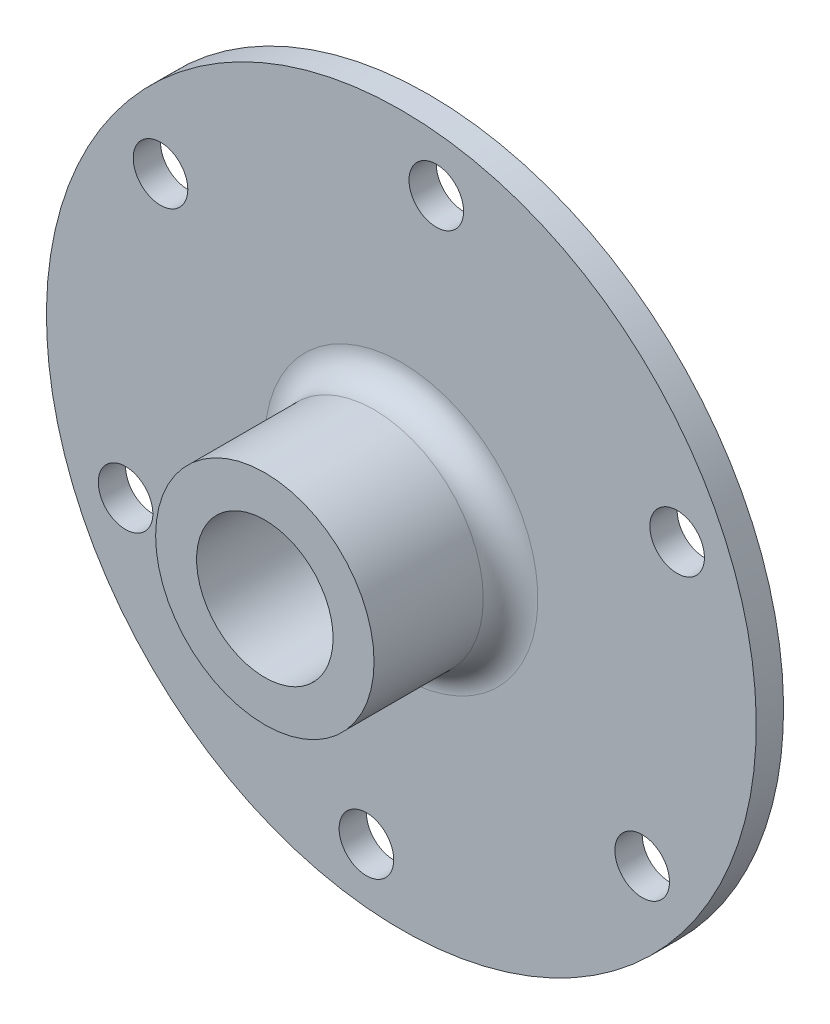
ISO-10303-21;
HEADER;
FILE_DESCRIPTION(('STEP AP214'),'2;1');
FILE_NAME('part.step','',(''),(''),'','','');
FILE_SCHEMA(('AUTOMOTIVE_DESIGN { 1 0 10303 214 1 1 1 1 }'));
ENDSEC;
DATA;
#1=APPLICATION_CONTEXT('core data for automotive mechanical design processes');
#2=APPLICATION_PROTOCOL_DEFINITION('international standard','automotive_design',2000,#1);
#3=PRODUCT_CONTEXT('',#1,'mechanical');
#4=PRODUCT('Part','Part','',(#3));
#5=PRODUCT_RELATED_PRODUCT_CATEGORY('part','',(#4));
#6=PRODUCT_DEFINITION_FORMATION('','',#4);
#7=PRODUCT_DEFINITION_CONTEXT('part definition',#1,'design');
#8=PRODUCT_DEFINITION('design','',#6,#7);
#9=PRODUCT_DEFINITION_SHAPE('','',#8);
#10=(LENGTH_UNIT() NAMED_UNIT(*) SI_UNIT(.MILLI.,.METRE.));
#11=(NAMED_UNIT(*) PLANE_ANGLE_UNIT() SI_UNIT($,.RADIAN.));
#12=(NAMED_UNIT(*) SI_UNIT($,.STERADIAN.) SOLID_ANGLE_UNIT());
#13=UNCERTAINTY_MEASURE_WITH_UNIT(LENGTH_MEASURE(1.E-05),#10,'distance_accuracy_value','');
#14=(GEOMETRIC_REPRESENTATION_CONTEXT(3) GLOBAL_UNCERTAINTY_ASSIGNED_CONTEXT((#13)) GLOBAL_UNIT_ASSIGNED_CONTEXT((#10,
#11,#12)) REPRESENTATION_CONTEXT('',''));
#15=CARTESIAN_POINT('',(0.,0.,0.));
#16=DIRECTION('',(0.,0.,1.));
#17=DIRECTION('',(1.,0.,0.));
#18=AXIS2_PLACEMENT_3D('',#15,#16,#17);
#19=CARTESIAN_POINT('',(0.,0.,19.05));
#20=DIRECTION('',(0.,0.,1.));
#21=DIRECTION('',(0.,-1.,0.));
#22=AXIS2_PLACEMENT_3D('',#19,#20,#21);
#23=PLANE('',#22);
#24=CARTESIAN_POINT('',(0.,0.,19.05));
#25=DIRECTION('',(0.,0.,1.));
#26=DIRECTION('',(1.,0.,0.));
#27=AXIS2_PLACEMENT_3D('',#24,#25,#26);
#28=CIRCLE('',#27,7.9375);
#29=CARTESIAN_POINT('',(7.9375,0.,19.05));
#30=VERTEX_POINT('',#29);
#31=EDGE_CURVE('E80',#30,#30,#28,.T.);
#32=ORIENTED_EDGE('',*,*,#31,.F.);
#33=EDGE_LOOP('',(#32));
#34=FACE_BOUND('',#33,.T.);
#35=CARTESIAN_POINT('',(0.,0.,19.05));
#36=DIRECTION('',(0.,0.,-1.));
#37=DIRECTION('',(0.,1.,0.));
#38=AXIS2_PLACEMENT_3D('',#35,#36,#37);
#39=CIRCLE('',#38,12.7);
#40=CARTESIAN_POINT('',(0.,12.7,19.05));
#41=VERTEX_POINT('',#40);
#42=EDGE_CURVE('E56',#41,#41,#39,.T.);
#43=ORIENTED_EDGE('',*,*,#42,.F.);
#44=EDGE_LOOP('',(#43));
#45=FACE_BOUND('',#44,.T.);
#46=ADVANCED_FACE('F43',(#34,#45),#23,.T.);
#47=CARTESIAN_POINT('',(0.,0.,0.));
#48=DIRECTION('',(0.,0.,-1.));
#49=DIRECTION('',(0.,1.,0.));
#50=AXIS2_PLACEMENT_3D('',#47,#48,#49);
#51=CYLINDRICAL_SURFACE('',#50,12.7);
#52=CARTESIAN_POINT('',(0.,0.,6.35));
#53=DIRECTION('',(0.,0.,1.));
#54=DIRECTION('',(0.,-1.,0.));
#55=AXIS2_PLACEMENT_3D('',#52,#53,#54);
#56=CIRCLE('',#55,12.7);
#57=CARTESIAN_POINT('',(0.,-12.7,6.34999999999999));
#58=VERTEX_POINT('',#57);
#59=EDGE_CURVE('E10',#58,#58,#56,.T.);
#60=ORIENTED_EDGE('',*,*,#59,.T.);
#61=EDGE_LOOP('',(#60));
#62=FACE_BOUND('',#61,.T.);
#63=ORIENTED_EDGE('',*,*,#42,.T.);
#64=EDGE_LOOP('',(#63));
#65=FACE_BOUND('',#64,.T.);
#66=ADVANCED_FACE('F148',(#62,#65),#51,.T.);
#67=CARTESIAN_POINT('',(0.,12.7,3.175));
#68=DIRECTION('',(0.,0.,1.));
#69=DIRECTION('',(0.,-1.,0.));
#70=AXIS2_PLACEMENT_3D('',#67,#68,#69);
#71=PLANE('',#70);
#72=CARTESIAN_POINT('',(0.,0.,3.175));
#73=DIRECTION('',(0.,0.,1.));
#74=DIRECTION('',(0.,-1.,0.));
#75=AXIS2_PLACEMENT_3D('',#72,#73,#74);
#76=CIRCLE('',#75,15.875);
#77=CARTESIAN_POINT('',(0.,-15.875,3.17499999999999));
#78=VERTEX_POINT('',#77);
#79=EDGE_CURVE('E51',#78,#78,#76,.F.);
#80=ORIENTED_EDGE('',*,*,#79,.T.);
#81=EDGE_LOOP('',(#80));
#82=FACE_BOUND('',#81,.T.);
#83=CARTESIAN_POINT('',(-32.0723720807494,-13.8245641563837,3.17499999999999));
#84=DIRECTION('',(0.,0.,1.));
#85=DIRECTION('',(0.,-1.,0.));
#86=AXIS2_PLACEMENT_3D('',#83,#84,#85);
#87=CIRCLE('',#86,3.175);
#88=CARTESIAN_POINT('',(-32.0723720807494,-16.9995641563837,3.17499999999999));
#89=VERTEX_POINT('',#88);
#90=EDGE_CURVE('E81',#89,#89,#87,.T.);
#91=ORIENTED_EDGE('',*,*,#90,.F.);
#92=EDGE_LOOP('',(#91));
#93=FACE_BOUND('',#92,.T.);
#94=CARTESIAN_POINT('',(32.0723720807493,13.8245641563839,3.175));
#95=DIRECTION('',(0.,0.,1.));
#96=DIRECTION('',(0.,-1.,0.));
#97=AXIS2_PLACEMENT_3D('',#94,#95,#96);
#98=CIRCLE('',#97,3.175);
#99=CARTESIAN_POINT('',(32.0723720807493,10.6495641563839,3.175));
#100=VERTEX_POINT('',#99);
#101=EDGE_CURVE('E91',#100,#100,#98,.T.);
#102=ORIENTED_EDGE('',*,*,#101,.F.);
#103=EDGE_LOOP('',(#102));
#104=FACE_BOUND('',#103,.T.);
#105=CARTESIAN_POINT('',(4.06376228469833,34.6877710597476,3.175));
#106=DIRECTION('',(0.,0.,1.));
#107=DIRECTION('',(0.,-1.,0.));
#108=AXIS2_PLACEMENT_3D('',#105,#106,#107);
#109=CIRCLE('',#108,3.175);
#110=CARTESIAN_POINT('',(4.06376228469833,31.5127710597476,3.175));
#111=VERTEX_POINT('',#110);
#112=EDGE_CURVE('E95',#111,#111,#109,.T.);
#113=ORIENTED_EDGE('',*,*,#112,.F.);
#114=EDGE_LOOP('',(#113));
#115=FACE_BOUND('',#114,.T.);
#116=CARTESIAN_POINT('',(-4.06376228469857,-34.6877710597476,3.17499999999999));
#117=DIRECTION('',(0.,0.,1.));
#118=DIRECTION('',(0.,-1.,0.));
#119=AXIS2_PLACEMENT_3D('',#116,#117,#118);
#120=CIRCLE('',#119,3.175);
#121=CARTESIAN_POINT('',(-4.06376228469857,-37.8627710597476,3.17499999999999));
#122=VERTEX_POINT('',#121);
#123=EDGE_CURVE('E99',#122,#122,#120,.T.);
#124=ORIENTED_EDGE('',*,*,#123,.F.);
#125=EDGE_LOOP('',(#124));
#126=FACE_BOUND('',#125,.T.);
#127=CARTESIAN_POINT('',(28.008609796051,-20.8632069033636,3.17499999999999));
#128=DIRECTION('',(0.,0.,1.));
#129=DIRECTION('',(0.,-1.,0.));
#130=AXIS2_PLACEMENT_3D('',#127,#128,#129);
#131=CIRCLE('',#130,3.175);
#132=CARTESIAN_POINT('',(28.008609796051,-24.0382069033636,3.17499999999999));
#133=VERTEX_POINT('',#132);
#134=EDGE_CURVE('E103',#133,#133,#131,.T.);
#135=ORIENTED_EDGE('',*,*,#134,.F.);
#136=EDGE_LOOP('',(#135));
#137=FACE_BOUND('',#136,.T.);
#138=CARTESIAN_POINT('',(-28.008609796051,20.8632069033636,3.175));
#139=DIRECTION('',(0.,0.,1.));
#140=DIRECTION('',(0.,-1.,0.));
#141=AXIS2_PLACEMENT_3D('',#138,#139,#140);
#142=CIRCLE('',#141,3.175);
#143=CARTESIAN_POINT('',(-24.833609796051,20.8632069033636,3.175));
#144=VERTEX_POINT('',#143);
#145=EDGE_CURVE('E71',#144,#144,#142,.T.);
#146=ORIENTED_EDGE('',*,*,#145,.F.);
#147=EDGE_LOOP('',(#146));
#148=FACE_BOUND('',#147,.T.);
#149=CARTESIAN_POINT('',(0.,0.,3.175));
#150=DIRECTION('',(0.,0.,-1.));
#151=DIRECTION('',(0.,1.,0.));
#152=AXIS2_PLACEMENT_3D('',#149,#150,#151);
#153=CIRCLE('',#152,41.275);
#154=CARTESIAN_POINT('',(0.,41.275,3.175));
#155=VERTEX_POINT('',#154);
#156=EDGE_CURVE('E61',#155,#155,#153,.T.);
#157=ORIENTED_EDGE('',*,*,#156,.F.);
#158=EDGE_LOOP('',(#157));
#159=FACE_BOUND('',#158,.T.);
#160=ADVANCED_FACE('F155',(#82,#93,#104,#115,#126,#137,#148,#159),#71,.T.);
#161=CARTESIAN_POINT('',(0.,0.,0.));
#162=DIRECTION('',(0.,0.,-1.));
#163=DIRECTION('',(0.,1.,0.));
#164=AXIS2_PLACEMENT_3D('',#161,#162,#163);
#165=CYLINDRICAL_SURFACE('',#164,41.275);
#166=ORIENTED_EDGE('',*,*,#156,.T.);
#167=EDGE_LOOP('',(#166));
#168=FACE_BOUND('',#167,.T.);
#169=CARTESIAN_POINT('',(0.,0.,0.));
#170=DIRECTION('',(0.,0.,-1.));
#171=DIRECTION('',(0.,1.,0.));
#172=AXIS2_PLACEMENT_3D('',#169,#170,#171);
#173=CIRCLE('',#172,41.275);
#174=CARTESIAN_POINT('',(0.,41.275,0.));
#175=VERTEX_POINT('',#174);
#176=EDGE_CURVE('E67',#175,#175,#173,.T.);
#177=ORIENTED_EDGE('',*,*,#176,.F.);
#178=EDGE_LOOP('',(#177));
#179=FACE_BOUND('',#178,.T.);
#180=ADVANCED_FACE('F162',(#168,#179),#165,.T.);
#181=CARTESIAN_POINT('',(0.,0.,0.));
#182=DIRECTION('',(0.,0.,-1.));
#183=DIRECTION('',(0.,1.,0.));
#184=AXIS2_PLACEMENT_3D('',#181,#182,#183);
#185=PLANE('',#184);
#186=CARTESIAN_POINT('',(-32.0723720807494,-13.8245641563837,0.));
#187=DIRECTION('',(0.,0.,1.));
#188=DIRECTION('',(0.50000000000001,0.866025403784433,0.));
#189=AXIS2_PLACEMENT_3D('',#186,#187,#188);
#190=CIRCLE('',#189,3.175);
#191=CARTESIAN_POINT('',(-30.4848720807493,-11.0749334993681,0.));
#192=VERTEX_POINT('',#191);
#193=EDGE_CURVE('E108',#192,#192,#190,.T.);
#194=ORIENTED_EDGE('',*,*,#193,.T.);
#195=EDGE_LOOP('',(#194));
#196=FACE_BOUND('',#195,.T.);
#197=CARTESIAN_POINT('',(32.0723720807493,13.8245641563839,0.));
#198=DIRECTION('',(0.,0.,1.));
#199=DIRECTION('',(-0.500000000000004,-0.866025403784436,0.));
#200=AXIS2_PLACEMENT_3D('',#197,#198,#199);
#201=CIRCLE('',#200,3.175);
#202=CARTESIAN_POINT('',(30.4848720807493,11.0749334993683,0.));
#203=VERTEX_POINT('',#202);
#204=EDGE_CURVE('E116',#203,#203,#201,.T.);
#205=ORIENTED_EDGE('',*,*,#204,.T.);
#206=EDGE_LOOP('',(#205));
#207=FACE_BOUND('',#206,.T.);
#208=CARTESIAN_POINT('',(4.06376228469833,34.6877710597476,0.));
#209=DIRECTION('',(0.,0.,1.));
#210=DIRECTION('',(0.499999999999998,-0.86602540378444,0.));
#211=AXIS2_PLACEMENT_3D('',#208,#209,#210);
#212=CIRCLE('',#211,3.175);
#213=CARTESIAN_POINT('',(5.65126228469832,31.938140402732,0.));
#214=VERTEX_POINT('',#213);
#215=EDGE_CURVE('E107',#214,#214,#212,.T.);
#216=ORIENTED_EDGE('',*,*,#215,.T.);
#217=EDGE_LOOP('',(#216));
#218=FACE_BOUND('',#217,.T.);
#219=CARTESIAN_POINT('',(-4.06376228469857,-34.6877710597476,0.));
#220=DIRECTION('',(0.,0.,1.));
#221=DIRECTION('',(-0.499999999999992,0.866025403784443,0.));
#222=AXIS2_PLACEMENT_3D('',#219,#220,#221);
#223=CIRCLE('',#222,3.175);
#224=CARTESIAN_POINT('',(-5.65126228469855,-31.938140402732,0.));
#225=VERTEX_POINT('',#224);
#226=EDGE_CURVE('E112',#225,#225,#223,.T.);
#227=ORIENTED_EDGE('',*,*,#226,.T.);
#228=EDGE_LOOP('',(#227));
#229=FACE_BOUND('',#228,.T.);
#230=CARTESIAN_POINT('',(28.008609796051,-20.8632069033636,0.));
#231=DIRECTION('',(0.,0.,1.));
#232=DIRECTION('',(-1.,0.,0.));
#233=AXIS2_PLACEMENT_3D('',#230,#231,#232);
#234=CIRCLE('',#233,3.175);
#235=CARTESIAN_POINT('',(24.833609796051,-20.8632069033636,0.));
#236=VERTEX_POINT('',#235);
#237=EDGE_CURVE('E120',#236,#236,#234,.T.);
#238=ORIENTED_EDGE('',*,*,#237,.T.);
#239=EDGE_LOOP('',(#238));
#240=FACE_BOUND('',#239,.T.);
#241=CARTESIAN_POINT('',(0.,0.,0.));
#242=DIRECTION('',(0.,0.,1.));
#243=DIRECTION('',(1.,0.,0.));
#244=AXIS2_PLACEMENT_3D('',#241,#242,#243);
#245=CIRCLE('',#244,7.9375);
#246=CARTESIAN_POINT('',(7.9375,0.,0.));
#247=VERTEX_POINT('',#246);
#248=EDGE_CURVE('E75',#247,#247,#245,.T.);
#249=ORIENTED_EDGE('',*,*,#248,.T.);
#250=EDGE_LOOP('',(#249));
#251=FACE_BOUND('',#250,.T.);
#252=CARTESIAN_POINT('',(-28.008609796051,20.8632069033636,0.));
#253=DIRECTION('',(0.,0.,1.));
#254=DIRECTION('',(1.,0.,0.));
#255=AXIS2_PLACEMENT_3D('',#252,#253,#254);
#256=CIRCLE('',#255,3.175);
#257=CARTESIAN_POINT('',(-24.833609796051,20.8632069033636,0.));
#258=VERTEX_POINT('',#257);
#259=EDGE_CURVE('E76',#258,#258,#256,.T.);
#260=ORIENTED_EDGE('',*,*,#259,.T.);
#261=EDGE_LOOP('',(#260));
#262=FACE_BOUND('',#261,.T.);
#263=ORIENTED_EDGE('',*,*,#176,.T.);
#264=EDGE_LOOP('',(#263));
#265=FACE_BOUND('',#264,.T.);
#266=ADVANCED_FACE('F128',(#196,#207,#218,#229,#240,#251,#262,#265),#185,.T.);
#267=CARTESIAN_POINT('',(-28.008609796051,20.8632069033636,0.));
#268=DIRECTION('',(0.,0.,1.));
#269=DIRECTION('',(1.,0.,0.));
#270=AXIS2_PLACEMENT_3D('',#267,#268,#269);
#271=CYLINDRICAL_SURFACE('',#270,3.175);
#272=CARTESIAN_POINT('',(-24.833609796051,20.8632069033636,3.175));
#273=CARTESIAN_POINT('',(-24.833609796051,20.8632069033636,3.14192708333333));
#274=CARTESIAN_POINT('',(-24.833609796051,20.8632069033636,3.10885416666666));
#275=CARTESIAN_POINT('',(-24.833609796051,20.8632069033636,3.04270833333333));
#276=CARTESIAN_POINT('',(-24.833609796051,20.8632069033636,3.00963541666666));
#277=CARTESIAN_POINT('',(-24.833609796051,20.8632069033636,2.94348958333333));
#278=CARTESIAN_POINT('',(-24.833609796051,20.8632069033636,2.91041666666666));
#279=CARTESIAN_POINT('',(-24.833609796051,20.8632069033636,2.84427083333333));
#280=CARTESIAN_POINT('',(-24.833609796051,20.8632069033636,2.81119791666666));
#281=CARTESIAN_POINT('',(-24.833609796051,20.8632069033636,2.74505208333333));
#282=CARTESIAN_POINT('',(-24.833609796051,20.8632069033636,2.71197916666666));
#283=CARTESIAN_POINT('',(-24.833609796051,20.8632069033636,2.64583333333333));
#284=CARTESIAN_POINT('',(-24.833609796051,20.8632069033636,2.61276041666666));
#285=CARTESIAN_POINT('',(-24.833609796051,20.8632069033636,2.54661458333333));
#286=CARTESIAN_POINT('',(-24.833609796051,20.8632069033636,2.51354166666667));
#287=CARTESIAN_POINT('',(-24.833609796051,20.8632069033636,2.44739583333333));
#288=CARTESIAN_POINT('',(-24.833609796051,20.8632069033636,2.41432291666667));
#289=CARTESIAN_POINT('',(-24.833609796051,20.8632069033636,2.34817708333333));
#290=CARTESIAN_POINT('',(-24.833609796051,20.8632069033636,2.31510416666667));
#291=CARTESIAN_POINT('',(-24.833609796051,20.8632069033636,2.24895833333333));
#292=CARTESIAN_POINT('',(-24.833609796051,20.8632069033636,2.21588541666666));
#293=CARTESIAN_POINT('',(-24.833609796051,20.8632069033636,2.14973958333333));
#294=CARTESIAN_POINT('',(-24.833609796051,20.8632069033636,2.11666666666666));
#295=CARTESIAN_POINT('',(-24.833609796051,20.8632069033636,2.05052083333333));
#296=CARTESIAN_POINT('',(-24.833609796051,20.8632069033636,2.01744791666667));
#297=CARTESIAN_POINT('',(-24.833609796051,20.8632069033636,1.95130208333333));
#298=CARTESIAN_POINT('',(-24.833609796051,20.8632069033636,1.91822916666667));
#299=CARTESIAN_POINT('',(-24.833609796051,20.8632069033636,1.85208333333333));
#300=CARTESIAN_POINT('',(-24.833609796051,20.8632069033636,1.81901041666667));
#301=CARTESIAN_POINT('',(-24.833609796051,20.8632069033636,1.75286458333333));
#302=CARTESIAN_POINT('',(-24.833609796051,20.8632069033636,1.71979166666667));
#303=CARTESIAN_POINT('',(-24.833609796051,20.8632069033636,1.65364583333333));
#304=CARTESIAN_POINT('',(-24.833609796051,20.8632069033636,1.62057291666667));
#305=CARTESIAN_POINT('',(-24.833609796051,20.8632069033636,1.55442708333333));
#306=CARTESIAN_POINT('',(-24.833609796051,20.8632069033636,1.52135416666667));
#307=CARTESIAN_POINT('',(-24.833609796051,20.8632069033636,1.45520833333333));
#308=CARTESIAN_POINT('',(-24.833609796051,20.8632069033636,1.42213541666667));
#309=CARTESIAN_POINT('',(-24.833609796051,20.8632069033636,1.35598958333333));
#310=CARTESIAN_POINT('',(-24.833609796051,20.8632069033636,1.32291666666667));
#311=CARTESIAN_POINT('',(-24.833609796051,20.8632069033636,1.25677083333333));
#312=CARTESIAN_POINT('',(-24.833609796051,20.8632069033636,1.22369791666667));
#313=CARTESIAN_POINT('',(-24.833609796051,20.8632069033636,1.15755208333333));
#314=CARTESIAN_POINT('',(-24.833609796051,20.8632069033636,1.12447916666667));
#315=CARTESIAN_POINT('',(-24.833609796051,20.8632069033636,1.05833333333333));
#316=CARTESIAN_POINT('',(-24.833609796051,20.8632069033636,1.02526041666667));
#317=CARTESIAN_POINT('',(-24.833609796051,20.8632069033636,0.959114583333333));
#318=CARTESIAN_POINT('',(-24.833609796051,20.8632069033636,0.926041666666666));
#319=CARTESIAN_POINT('',(-24.833609796051,20.8632069033636,0.859895833333333));
#320=CARTESIAN_POINT('',(-24.833609796051,20.8632069033636,0.826822916666666));
#321=CARTESIAN_POINT('',(-24.833609796051,20.8632069033636,0.760677083333333));
#322=CARTESIAN_POINT('',(-24.833609796051,20.8632069033636,0.727604166666666));
#323=CARTESIAN_POINT('',(-24.833609796051,20.8632069033636,0.661458333333333));
#324=CARTESIAN_POINT('',(-24.833609796051,20.8632069033636,0.628385416666666));
#325=CARTESIAN_POINT('',(-24.833609796051,20.8632069033636,0.562239583333333));
#326=CARTESIAN_POINT('',(-24.833609796051,20.8632069033636,0.529166666666666));
#327=CARTESIAN_POINT('',(-24.833609796051,20.8632069033636,0.463020833333333));
#328=CARTESIAN_POINT('',(-24.833609796051,20.8632069033636,0.429947916666666));
#329=CARTESIAN_POINT('',(-24.833609796051,20.8632069033636,0.363802083333333));
#330=CARTESIAN_POINT('',(-24.833609796051,20.8632069033636,0.330729166666666));
#331=CARTESIAN_POINT('',(-24.833609796051,20.8632069033636,0.264583333333333));
#332=CARTESIAN_POINT('',(-24.833609796051,20.8632069033636,0.231510416666666));
#333=CARTESIAN_POINT('',(-24.833609796051,20.8632069033636,0.165364583333333));
#334=CARTESIAN_POINT('',(-24.833609796051,20.8632069033636,0.132291666666667));
#335=CARTESIAN_POINT('',(-24.833609796051,20.8632069033636,0.0661458333333333));
#336=CARTESIAN_POINT('',(-24.833609796051,20.8632069033636,0.0330729166666666));
#337=CARTESIAN_POINT('',(-24.833609796051,20.8632069033636,0.));
#338=B_SPLINE_CURVE_WITH_KNOTS('',3,(#272,#273,#274,#275,#276,#277,#278,#279,#280,#281,#282,
#283,#284,#285,#286,#287,#288,#289,#290,#291,#292,#293,#294,#295,#296,#297,#298,#299,#300,#301,
#302,#303,#304,#305,#306,#307,#308,#309,#310,#311,#312,#313,#314,#315,#316,#317,#318,#319,#320,
#321,#322,#323,#324,#325,#326,#327,#328,#329,#330,#331,#332,#333,#334,#335,#336,#337),
.UNSPECIFIED.,.F.,.F.,(4,2,2,2,2,2,2,2,2,2,2,2,2,2,2,2,2,2,2,2,2,2,2,2,2,2,2,2,2,2,2,2,4),(0.,
0.0992187499999999,0.1984375,0.29765625,0.396875,0.49609375,0.595312499999999,0.69453125,
0.793749999999999,0.89296875,0.992187499999999,1.09140625,1.190625,1.28984375,1.3890625,
1.48828125,1.5875,1.68671875,1.7859375,1.88515625,1.984375,2.08359375,2.1828125,2.28203125,
2.38125,2.48046875,2.5796875,2.67890625,2.778125,2.87734375,2.9765625,3.07578125,3.175),.UNSPECIFIED.);
#339=EDGE_CURVE('BSEAM167',#144,#258,#338,.T.);
#340=ORIENTED_EDGE('',*,*,#145,.T.);
#341=ORIENTED_EDGE('',*,*,#259,.F.);
#342=ORIENTED_EDGE('',*,*,#339,.T.);
#343=ORIENTED_EDGE('',*,*,#339,.F.);
#344=EDGE_LOOP('',(#340,#342,#341,#343));
#345=FACE_BOUND('',#344,.T.);
#346=ADVANCED_FACE('F167',(#345),#271,.F.);
#347=CARTESIAN_POINT('',(0.,0.,0.));
#348=DIRECTION('',(0.,0.,1.));
#349=DIRECTION('',(1.,0.,0.));
#350=AXIS2_PLACEMENT_3D('',#347,#348,#349);
#351=CYLINDRICAL_SURFACE('',#350,7.9375);
#352=CARTESIAN_POINT('',(7.9375,0.,0.));
#353=CARTESIAN_POINT('',(7.9375,0.,0.1984375));
#354=CARTESIAN_POINT('',(7.9375,0.,0.396875));
#355=CARTESIAN_POINT('',(7.9375,0.,0.79375));
#356=CARTESIAN_POINT('',(7.9375,0.,0.9921875));
#357=CARTESIAN_POINT('',(7.9375,0.,1.3890625));
#358=CARTESIAN_POINT('',(7.9375,0.,1.5875));
#359=CARTESIAN_POINT('',(7.9375,0.,1.984375));
#360=CARTESIAN_POINT('',(7.9375,0.,2.1828125));
#361=CARTESIAN_POINT('',(7.9375,0.,2.5796875));
#362=CARTESIAN_POINT('',(7.9375,0.,2.778125));
#363=CARTESIAN_POINT('',(7.9375,0.,3.175));
#364=CARTESIAN_POINT('',(7.9375,0.,3.3734375));
#365=CARTESIAN_POINT('',(7.9375,0.,3.7703125));
#366=CARTESIAN_POINT('',(7.9375,0.,3.96875));
#367=CARTESIAN_POINT('',(7.9375,0.,4.365625));
#368=CARTESIAN_POINT('',(7.9375,0.,4.5640625));
#369=CARTESIAN_POINT('',(7.9375,0.,4.9609375));
#370=CARTESIAN_POINT('',(7.9375,0.,5.159375));
#371=CARTESIAN_POINT('',(7.9375,0.,5.55625));
#372=CARTESIAN_POINT('',(7.9375,0.,5.7546875));
#373=CARTESIAN_POINT('',(7.9375,0.,6.1515625));
#374=CARTESIAN_POINT('',(7.9375,0.,6.35));
#375=CARTESIAN_POINT('',(7.9375,0.,6.746875));
#376=CARTESIAN_POINT('',(7.9375,0.,6.9453125));
#377=CARTESIAN_POINT('',(7.9375,0.,7.3421875));
#378=CARTESIAN_POINT('',(7.9375,0.,7.540625));
#379=CARTESIAN_POINT('',(7.9375,0.,7.9375));
#380=CARTESIAN_POINT('',(7.9375,0.,8.1359375));
#381=CARTESIAN_POINT('',(7.9375,0.,8.5328125));
#382=CARTESIAN_POINT('',(7.9375,0.,8.73125));
#383=CARTESIAN_POINT('',(7.9375,0.,9.128125));
#384=CARTESIAN_POINT('',(7.9375,0.,9.3265625));
#385=CARTESIAN_POINT('',(7.9375,0.,9.7234375));
#386=CARTESIAN_POINT('',(7.9375,0.,9.921875));
#387=CARTESIAN_POINT('',(7.9375,0.,10.31875));
#388=CARTESIAN_POINT('',(7.9375,0.,10.5171875));
#389=CARTESIAN_POINT('',(7.9375,0.,10.9140625));
#390=CARTESIAN_POINT('',(7.9375,0.,11.1125));
#391=CARTESIAN_POINT('',(7.9375,0.,11.509375));
#392=CARTESIAN_POINT('',(7.9375,0.,11.7078125));
#393=CARTESIAN_POINT('',(7.9375,0.,12.1046875));
#394=CARTESIAN_POINT('',(7.9375,0.,12.303125));
#395=CARTESIAN_POINT('',(7.9375,0.,12.7));
#396=CARTESIAN_POINT('',(7.9375,0.,12.8984375));
#397=CARTESIAN_POINT('',(7.9375,0.,13.2953125));
#398=CARTESIAN_POINT('',(7.9375,0.,13.49375));
#399=CARTESIAN_POINT('',(7.9375,0.,13.890625));
#400=CARTESIAN_POINT('',(7.9375,0.,14.0890625));
#401=CARTESIAN_POINT('',(7.9375,0.,14.4859375));
#402=CARTESIAN_POINT('',(7.9375,0.,14.684375));
#403=CARTESIAN_POINT('',(7.9375,0.,15.08125));
#404=CARTESIAN_POINT('',(7.9375,0.,15.2796875));
#405=CARTESIAN_POINT('',(7.9375,0.,15.6765625));
#406=CARTESIAN_POINT('',(7.9375,0.,15.875));
#407=CARTESIAN_POINT('',(7.9375,0.,16.271875));
#408=CARTESIAN_POINT('',(7.9375,0.,16.4703125));
#409=CARTESIAN_POINT('',(7.9375,0.,16.8671875));
#410=CARTESIAN_POINT('',(7.9375,0.,17.065625));
#411=CARTESIAN_POINT('',(7.9375,0.,17.4625));
#412=CARTESIAN_POINT('',(7.9375,0.,17.6609375));
#413=CARTESIAN_POINT('',(7.9375,0.,18.0578125));
#414=CARTESIAN_POINT('',(7.9375,0.,18.25625));
#415=CARTESIAN_POINT('',(7.9375,0.,18.653125));
#416=CARTESIAN_POINT('',(7.9375,0.,18.8515625));
#417=CARTESIAN_POINT('',(7.9375,0.,19.05));
#418=B_SPLINE_CURVE_WITH_KNOTS('',3,(#352,#353,#354,#355,#356,#357,#358,#359,#360,#361,#362,
#363,#364,#365,#366,#367,#368,#369,#370,#371,#372,#373,#374,#375,#376,#377,#378,#379,#380,#381,
#382,#383,#384,#385,#386,#387,#388,#389,#390,#391,#392,#393,#394,#395,#396,#397,#398,#399,#400,
#401,#402,#403,#404,#405,#406,#407,#408,#409,#410,#411,#412,#413,#414,#415,#416,#417),
.UNSPECIFIED.,.F.,.F.,(4,2,2,2,2,2,2,2,2,2,2,2,2,2,2,2,2,2,2,2,2,2,2,2,2,2,2,2,2,2,2,2,4),(0.,
0.5953125,1.190625,1.7859375,2.38125,2.9765625,3.571875,4.1671875,4.7625,5.3578125,5.953125,
6.5484375,7.14375,7.7390625,8.334375,8.9296875,9.525,10.1203125,10.715625,11.3109375,11.90625,
12.5015625,13.096875,13.6921875,14.2875,14.8828125,15.478125,16.0734375,16.66875,17.2640625,
17.859375,18.4546875,19.05),.UNSPECIFIED.);
#419=EDGE_CURVE('BSEAM144',#247,#30,#418,.T.);
#420=ORIENTED_EDGE('',*,*,#248,.F.);
#421=ORIENTED_EDGE('',*,*,#31,.T.);
#422=ORIENTED_EDGE('',*,*,#419,.T.);
#423=ORIENTED_EDGE('',*,*,#419,.F.);
#424=EDGE_LOOP('',(#420,#422,#421,#423));
#425=FACE_BOUND('',#424,.T.);
#426=ADVANCED_FACE('F144',(#425),#351,.F.);
#427=CARTESIAN_POINT('',(28.008609796051,-20.8632069033636,0.));
#428=DIRECTION('',(0.,0.,1.));
#429=DIRECTION('',(0.,-1.,0.));
#430=AXIS2_PLACEMENT_3D('',#427,#428,#429);
#431=CYLINDRICAL_SURFACE('',#430,3.175);
#432=ORIENTED_EDGE('',*,*,#134,.T.);
#433=EDGE_LOOP('',(#432));
#434=FACE_BOUND('',#433,.T.);
#435=ORIENTED_EDGE('',*,*,#237,.F.);
#436=EDGE_LOOP('',(#435));
#437=FACE_BOUND('',#436,.T.);
#438=ADVANCED_FACE('F134',(#434,#437),#431,.F.);
#439=CARTESIAN_POINT('',(-4.06376228469857,-34.6877710597476,0.));
#440=DIRECTION('',(0.,0.,1.));
#441=DIRECTION('',(0.,-1.,0.));
#442=AXIS2_PLACEMENT_3D('',#439,#440,#441);
#443=CYLINDRICAL_SURFACE('',#442,3.175);
#444=ORIENTED_EDGE('',*,*,#123,.T.);
#445=EDGE_LOOP('',(#444));
#446=FACE_BOUND('',#445,.T.);
#447=ORIENTED_EDGE('',*,*,#226,.F.);
#448=EDGE_LOOP('',(#447));
#449=FACE_BOUND('',#448,.T.);
#450=ADVANCED_FACE('F131',(#446,#449),#443,.F.);
#451=CARTESIAN_POINT('',(4.06376228469833,34.6877710597476,0.));
#452=DIRECTION('',(0.,0.,1.));
#453=DIRECTION('',(1.,0.,0.));
#454=AXIS2_PLACEMENT_3D('',#451,#452,#453);
#455=CYLINDRICAL_SURFACE('',#454,3.175);
#456=ORIENTED_EDGE('',*,*,#112,.T.);
#457=EDGE_LOOP('',(#456));
#458=FACE_BOUND('',#457,.T.);
#459=ORIENTED_EDGE('',*,*,#215,.F.);
#460=EDGE_LOOP('',(#459));
#461=FACE_BOUND('',#460,.T.);
#462=ADVANCED_FACE('F133',(#458,#461),#455,.F.);
#463=CARTESIAN_POINT('',(32.0723720807493,13.8245641563839,0.));
#464=DIRECTION('',(0.,0.,1.));
#465=DIRECTION('',(0.,-1.,0.));
#466=AXIS2_PLACEMENT_3D('',#463,#464,#465);
#467=CYLINDRICAL_SURFACE('',#466,3.175);
#468=ORIENTED_EDGE('',*,*,#101,.T.);
#469=EDGE_LOOP('',(#468));
#470=FACE_BOUND('',#469,.T.);
#471=ORIENTED_EDGE('',*,*,#204,.F.);
#472=EDGE_LOOP('',(#471));
#473=FACE_BOUND('',#472,.T.);
#474=ADVANCED_FACE('F141',(#470,#473),#467,.F.);
#475=CARTESIAN_POINT('',(-32.0723720807494,-13.8245641563837,0.));
#476=DIRECTION('',(0.,0.,1.));
#477=DIRECTION('',(1.,0.,0.));
#478=AXIS2_PLACEMENT_3D('',#475,#476,#477);
#479=CYLINDRICAL_SURFACE('',#478,3.175);
#480=ORIENTED_EDGE('',*,*,#90,.T.);
#481=EDGE_LOOP('',(#480));
#482=FACE_BOUND('',#481,.T.);
#483=ORIENTED_EDGE('',*,*,#193,.F.);
#484=EDGE_LOOP('',(#483));
#485=FACE_BOUND('',#484,.T.);
#486=ADVANCED_FACE('F174',(#482,#485),#479,.F.);
#487=CARTESIAN_POINT('',(0.,0.,6.35));
#488=DIRECTION('',(0.,0.,1.));
#489=DIRECTION('',(0.,-1.,0.));
#490=AXIS2_PLACEMENT_3D('',#487,#488,#489);
#491=TOROIDAL_SURFACE('',#490,15.875,3.175);
#492=ORIENTED_EDGE('',*,*,#59,.F.);
#493=EDGE_LOOP('',(#492));
#494=FACE_BOUND('',#493,.T.);
#495=ORIENTED_EDGE('',*,*,#79,.F.);
#496=EDGE_LOOP('',(#495));
#497=FACE_BOUND('',#496,.T.);
#498=ADVANCED_FACE('F45',(#494,#497),#491,.F.);
#499=CLOSED_SHELL('',(#46,#66,#160,#180,#266,#346,#426,#438,#450,#462,#474,#486,#498));
#500=MANIFOLD_SOLID_BREP('B2',#499);
#501=ADVANCED_BREP_SHAPE_REPRESENTATION('',(#18,#500),#14);
#502=SHAPE_DEFINITION_REPRESENTATION(#9,#501);
ENDSEC;
END-ISO-10303-21;
